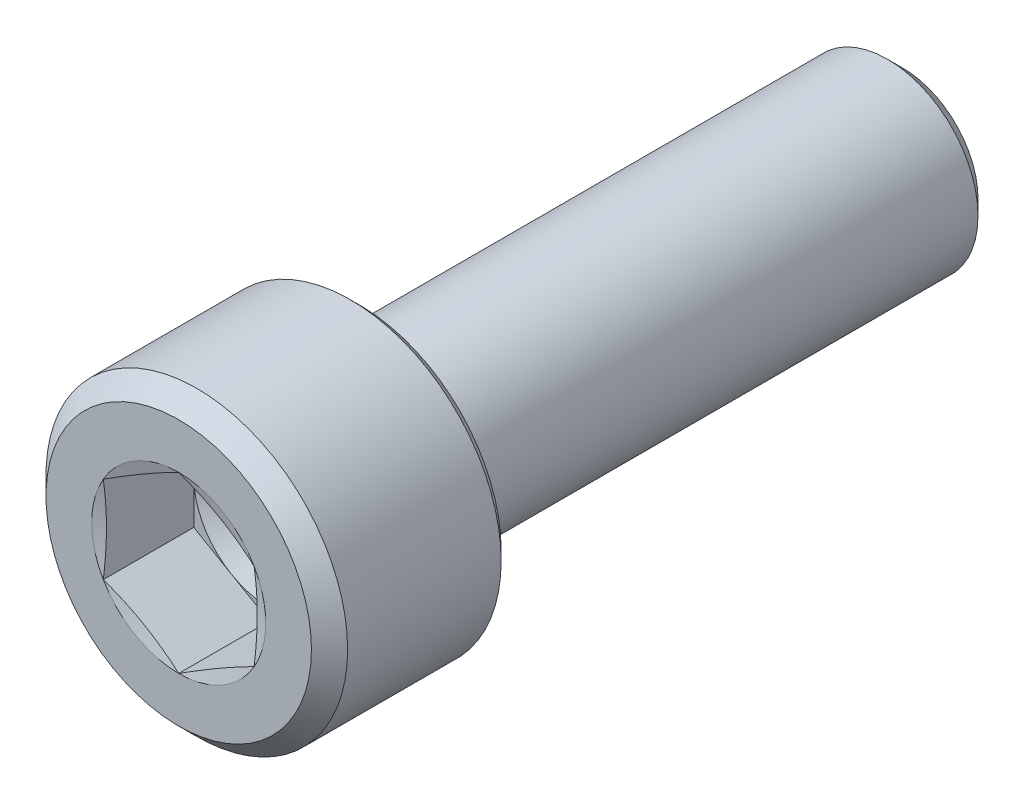
ISO-10303-21;
HEADER;
FILE_DESCRIPTION(('STEP AP214'),'2;1');
FILE_NAME('part.step','',(''),(''),'','','');
FILE_SCHEMA(('AUTOMOTIVE_DESIGN { 1 0 10303 214 1 1 1 1 }'));
ENDSEC;
DATA;
#1=APPLICATION_CONTEXT('core data for automotive mechanical design processes');
#2=APPLICATION_PROTOCOL_DEFINITION('international standard','automotive_design',2000,#1);
#3=PRODUCT_CONTEXT('',#1,'mechanical');
#4=PRODUCT('Part','Part','',(#3));
#5=PRODUCT_RELATED_PRODUCT_CATEGORY('part','',(#4));
#6=PRODUCT_DEFINITION_FORMATION('','',#4);
#7=PRODUCT_DEFINITION_CONTEXT('part definition',#1,'design');
#8=PRODUCT_DEFINITION('design','',#6,#7);
#9=PRODUCT_DEFINITION_SHAPE('','',#8);
#10=(LENGTH_UNIT() NAMED_UNIT(*) SI_UNIT(.MILLI.,.METRE.));
#11=(NAMED_UNIT(*) PLANE_ANGLE_UNIT() SI_UNIT($,.RADIAN.));
#12=(NAMED_UNIT(*) SI_UNIT($,.STERADIAN.) SOLID_ANGLE_UNIT());
#13=UNCERTAINTY_MEASURE_WITH_UNIT(LENGTH_MEASURE(1.E-05),#10,'distance_accuracy_value','');
#14=(GEOMETRIC_REPRESENTATION_CONTEXT(3) GLOBAL_UNCERTAINTY_ASSIGNED_CONTEXT((#13)) GLOBAL_UNIT_ASSIGNED_CONTEXT((#10,
#11,#12)) REPRESENTATION_CONTEXT('',''));
#15=CARTESIAN_POINT('',(0.,0.,0.));
#16=DIRECTION('',(0.,0.,1.));
#17=DIRECTION('',(1.,0.,0.));
#18=AXIS2_PLACEMENT_3D('',#15,#16,#17);
#19=CARTESIAN_POINT('',(0.,0.,0.));
#20=DIRECTION('',(0.,0.,-1.));
#21=DIRECTION('',(-1.,0.,0.));
#22=AXIS2_PLACEMENT_3D('',#19,#20,#21);
#23=PLANE('',#22);
#24=CARTESIAN_POINT('',(0.,0.,0.));
#25=DIRECTION('',(0.,0.,1.));
#26=DIRECTION('',(1.,0.,0.));
#27=AXIS2_PLACEMENT_3D('',#24,#25,#26);
#28=CIRCLE('',#27,4.4);
#29=CARTESIAN_POINT('',(4.4,0.,0.));
#30=VERTEX_POINT('',#29);
#31=EDGE_CURVE('E203',#30,#30,#28,.T.);
#32=ORIENTED_EDGE('',*,*,#31,.T.);
#33=EDGE_LOOP('',(#32));
#34=FACE_BOUND('',#33,.T.);
#35=CARTESIAN_POINT('',(0.,0.,0.));
#36=DIRECTION('',(0.,0.,1.));
#37=DIRECTION('',(1.,0.,0.));
#38=AXIS2_PLACEMENT_3D('',#35,#36,#37);
#39=CIRCLE('',#38,2.88675134594813);
#40=CARTESIAN_POINT('',(-2.5,-1.44337567297407,0.));
#41=VERTEX_POINT('',#40);
#42=CARTESIAN_POINT('',(0.,-2.88675134594813,0.));
#43=VERTEX_POINT('',#42);
#44=EDGE_CURVE('E131',#41,#43,#39,.T.);
#45=ORIENTED_EDGE('',*,*,#44,.F.);
#46=CARTESIAN_POINT('',(-2.5,1.44337567297407,0.));
#47=VERTEX_POINT('',#46);
#48=EDGE_CURVE('E130',#47,#41,#39,.T.);
#49=ORIENTED_EDGE('',*,*,#48,.F.);
#50=CARTESIAN_POINT('',(0.,2.88675134594813,0.));
#51=VERTEX_POINT('',#50);
#52=EDGE_CURVE('E97',#51,#47,#39,.T.);
#53=ORIENTED_EDGE('',*,*,#52,.F.);
#54=CARTESIAN_POINT('',(2.5,1.44337567297407,0.));
#55=VERTEX_POINT('',#54);
#56=EDGE_CURVE('E91',#55,#51,#39,.T.);
#57=ORIENTED_EDGE('',*,*,#56,.F.);
#58=CARTESIAN_POINT('',(2.5,-1.44337567297406,0.));
#59=VERTEX_POINT('',#58);
#60=EDGE_CURVE('E99',#59,#55,#39,.T.);
#61=ORIENTED_EDGE('',*,*,#60,.F.);
#62=EDGE_CURVE('E287',#43,#59,#39,.T.);
#63=ORIENTED_EDGE('',*,*,#62,.F.);
#64=EDGE_LOOP('',(#45,#49,#53,#57,#61,#63));
#65=FACE_BOUND('',#64,.T.);
#66=ADVANCED_FACE('F15',(#34,#65),#23,.F.);
#67=CARTESIAN_POINT('',(0.,0.,-0.599999999999999));
#68=DIRECTION('',(0.,0.,-1.));
#69=DIRECTION('',(-1.,0.,0.));
#70=AXIS2_PLACEMENT_3D('',#67,#68,#69);
#71=CONICAL_SURFACE('',#70,5.,0.78539816339745);
#72=ORIENTED_EDGE('',*,*,#31,.F.);
#73=EDGE_LOOP('',(#72));
#74=FACE_BOUND('',#73,.T.);
#75=CARTESIAN_POINT('',(0.,0.,-0.599999999999999));
#76=DIRECTION('',(0.,0.,1.));
#77=DIRECTION('',(1.,0.,0.));
#78=AXIS2_PLACEMENT_3D('',#75,#76,#77);
#79=CIRCLE('',#78,5.);
#80=CARTESIAN_POINT('',(5.,0.,-0.599999999999999));
#81=VERTEX_POINT('',#80);
#82=EDGE_CURVE('E205',#81,#81,#79,.T.);
#83=ORIENTED_EDGE('',*,*,#82,.T.);
#84=EDGE_LOOP('',(#83));
#85=FACE_BOUND('',#84,.T.);
#86=ADVANCED_FACE('F193',(#74,#85),#71,.T.);
#87=CARTESIAN_POINT('',(0.,0.,0.));
#88=DIRECTION('',(0.,0.,1.));
#89=DIRECTION('',(1.,0.,0.));
#90=AXIS2_PLACEMENT_3D('',#87,#88,#89);
#91=CYLINDRICAL_SURFACE('',#90,5.);
#92=ORIENTED_EDGE('',*,*,#82,.F.);
#93=EDGE_LOOP('',(#92));
#94=FACE_BOUND('',#93,.T.);
#95=CARTESIAN_POINT('',(0.,0.,-5.69));
#96=DIRECTION('',(0.,0.,1.));
#97=DIRECTION('',(1.,0.,0.));
#98=AXIS2_PLACEMENT_3D('',#95,#96,#97);
#99=CIRCLE('',#98,5.);
#100=CARTESIAN_POINT('',(5.,0.,-5.69));
#101=VERTEX_POINT('',#100);
#102=EDGE_CURVE('E208',#101,#101,#99,.T.);
#103=ORIENTED_EDGE('',*,*,#102,.T.);
#104=EDGE_LOOP('',(#103));
#105=FACE_BOUND('',#104,.T.);
#106=ADVANCED_FACE('F199',(#94,#105),#91,.T.);
#107=CARTESIAN_POINT('',(0.,0.,-6.));
#108=DIRECTION('',(0.,0.,1.));
#109=DIRECTION('',(1.,0.,0.));
#110=AXIS2_PLACEMENT_3D('',#107,#108,#109);
#111=CONICAL_SURFACE('',#110,4.69,0.785398163397452);
#112=ORIENTED_EDGE('',*,*,#102,.F.);
#113=EDGE_LOOP('',(#112));
#114=FACE_BOUND('',#113,.T.);
#115=CARTESIAN_POINT('',(0.,0.,-6.));
#116=DIRECTION('',(0.,0.,1.));
#117=DIRECTION('',(1.,0.,0.));
#118=AXIS2_PLACEMENT_3D('',#115,#116,#117);
#119=CIRCLE('',#118,4.69);
#120=CARTESIAN_POINT('',(4.69,0.,-6.));
#121=VERTEX_POINT('',#120);
#122=EDGE_CURVE('E213',#121,#121,#119,.T.);
#123=ORIENTED_EDGE('',*,*,#122,.T.);
#124=EDGE_LOOP('',(#123));
#125=FACE_BOUND('',#124,.T.);
#126=ADVANCED_FACE('F421',(#114,#125),#111,.T.);
#127=CARTESIAN_POINT('',(0.,4.69,-6.));
#128=DIRECTION('',(0.,0.,1.));
#129=DIRECTION('',(1.,0.,0.));
#130=AXIS2_PLACEMENT_3D('',#127,#128,#129);
#131=PLANE('',#130);
#132=ORIENTED_EDGE('',*,*,#122,.F.);
#133=EDGE_LOOP('',(#132));
#134=FACE_BOUND('',#133,.T.);
#135=CARTESIAN_POINT('',(0.,0.,-6.));
#136=DIRECTION('',(0.,0.,1.));
#137=DIRECTION('',(1.,0.,0.));
#138=AXIS2_PLACEMENT_3D('',#135,#136,#137);
#139=CIRCLE('',#138,3.4);
#140=CARTESIAN_POINT('',(3.4,0.,-6.));
#141=VERTEX_POINT('',#140);
#142=EDGE_CURVE('E216',#141,#141,#139,.T.);
#143=ORIENTED_EDGE('',*,*,#142,.T.);
#144=EDGE_LOOP('',(#143));
#145=FACE_BOUND('',#144,.T.);
#146=ADVANCED_FACE('F412',(#134,#145),#131,.F.);
#147=CARTESIAN_POINT('',(0.,0.,-6.25));
#148=DIRECTION('',(0.,0.,1.));
#149=DIRECTION('',(1.,0.,0.));
#150=AXIS2_PLACEMENT_3D('',#147,#148,#149);
#151=TOROIDAL_SURFACE('',#150,3.4,0.249999999999999);
#152=ORIENTED_EDGE('',*,*,#142,.F.);
#153=EDGE_LOOP('',(#152));
#154=FACE_BOUND('',#153,.T.);
#155=CARTESIAN_POINT('',(0.,0.,-6.16765696092043));
#156=DIRECTION('',(0.,0.,1.));
#157=DIRECTION('',(1.,0.,0.));
#158=AXIS2_PLACEMENT_3D('',#155,#156,#157);
#159=CIRCLE('',#158,3.16394995463856);
#160=CARTESIAN_POINT('',(3.16394995463856,0.,-6.16765696092043));
#161=VERTEX_POINT('',#160);
#162=EDGE_CURVE('E219',#161,#161,#159,.T.);
#163=ORIENTED_EDGE('',*,*,#162,.T.);
#164=EDGE_LOOP('',(#163));
#165=FACE_BOUND('',#164,.T.);
#166=ADVANCED_FACE('F403',(#154,#165),#151,.F.);
#167=CARTESIAN_POINT('',(0.,0.,-6.59765696092043));
#168=DIRECTION('',(0.,0.,1.));
#169=DIRECTION('',(1.,0.,0.));
#170=AXIS2_PLACEMENT_3D('',#167,#168,#169);
#171=CONICAL_SURFACE('',#170,3.01394995463856,0.335638550327612);
#172=ORIENTED_EDGE('',*,*,#162,.F.);
#173=EDGE_LOOP('',(#172));
#174=FACE_BOUND('',#173,.T.);
#175=CARTESIAN_POINT('',(0.,0.,-6.59765696092043));
#176=DIRECTION('',(0.,0.,1.));
#177=DIRECTION('',(1.,0.,0.));
#178=AXIS2_PLACEMENT_3D('',#175,#176,#177);
#179=CIRCLE('',#178,3.01394995463856);
#180=CARTESIAN_POINT('',(3.01394995463856,0.,-6.59765696092043));
#181=VERTEX_POINT('',#180);
#182=EDGE_CURVE('E222',#181,#181,#179,.T.);
#183=ORIENTED_EDGE('',*,*,#182,.T.);
#184=EDGE_LOOP('',(#183));
#185=FACE_BOUND('',#184,.T.);
#186=ADVANCED_FACE('F394',(#174,#185),#171,.T.);
#187=CARTESIAN_POINT('',(0.,0.,-6.68));
#188=DIRECTION('',(0.,0.,1.));
#189=DIRECTION('',(1.,0.,0.));
#190=AXIS2_PLACEMENT_3D('',#187,#188,#189);
#191=TOROIDAL_SURFACE('',#190,3.25,0.25);
#192=ORIENTED_EDGE('',*,*,#182,.F.);
#193=EDGE_LOOP('',(#192));
#194=FACE_BOUND('',#193,.T.);
#195=CARTESIAN_POINT('',(0.,0.,-6.68));
#196=DIRECTION('',(0.,0.,1.));
#197=DIRECTION('',(1.,0.,0.));
#198=AXIS2_PLACEMENT_3D('',#195,#196,#197);
#199=CIRCLE('',#198,3.);
#200=CARTESIAN_POINT('',(3.,0.,-6.68));
#201=VERTEX_POINT('',#200);
#202=EDGE_CURVE('E225',#201,#201,#199,.T.);
#203=ORIENTED_EDGE('',*,*,#202,.T.);
#204=EDGE_LOOP('',(#203));
#205=FACE_BOUND('',#204,.T.);
#206=ADVANCED_FACE('F385',(#194,#205),#191,.F.);
#207=CARTESIAN_POINT('',(0.,0.,0.));
#208=DIRECTION('',(0.,0.,1.));
#209=DIRECTION('',(1.,0.,0.));
#210=AXIS2_PLACEMENT_3D('',#207,#208,#209);
#211=CYLINDRICAL_SURFACE('',#210,3.);
#212=ORIENTED_EDGE('',*,*,#202,.F.);
#213=EDGE_LOOP('',(#212));
#214=FACE_BOUND('',#213,.T.);
#215=CARTESIAN_POINT('',(0.,0.,-23.5));
#216=DIRECTION('',(0.,0.,1.));
#217=DIRECTION('',(1.,0.,0.));
#218=AXIS2_PLACEMENT_3D('',#215,#216,#217);
#219=CIRCLE('',#218,3.);
#220=CARTESIAN_POINT('',(3.,0.,-23.5));
#221=VERTEX_POINT('',#220);
#222=EDGE_CURVE('E228',#221,#221,#219,.T.);
#223=ORIENTED_EDGE('',*,*,#222,.T.);
#224=EDGE_LOOP('',(#223));
#225=FACE_BOUND('',#224,.T.);
#226=ADVANCED_FACE('F376',(#214,#225),#211,.T.);
#227=CARTESIAN_POINT('',(0.,0.,-24.));
#228=DIRECTION('',(0.,0.,1.));
#229=DIRECTION('',(1.,0.,0.));
#230=AXIS2_PLACEMENT_3D('',#227,#228,#229);
#231=CONICAL_SURFACE('',#230,2.5,0.785398163397455);
#232=ORIENTED_EDGE('',*,*,#222,.F.);
#233=EDGE_LOOP('',(#232));
#234=FACE_BOUND('',#233,.T.);
#235=CARTESIAN_POINT('',(0.,0.,-24.));
#236=DIRECTION('',(0.,0.,1.));
#237=DIRECTION('',(1.,0.,0.));
#238=AXIS2_PLACEMENT_3D('',#235,#236,#237);
#239=CIRCLE('',#238,2.5);
#240=CARTESIAN_POINT('',(2.5,0.,-24.));
#241=VERTEX_POINT('',#240);
#242=EDGE_CURVE('E231',#241,#241,#239,.T.);
#243=ORIENTED_EDGE('',*,*,#242,.T.);
#244=EDGE_LOOP('',(#243));
#245=FACE_BOUND('',#244,.T.);
#246=ADVANCED_FACE('F367',(#234,#245),#231,.T.);
#247=CARTESIAN_POINT('',(0.,2.5,-24.));
#248=DIRECTION('',(0.,0.,1.));
#249=DIRECTION('',(1.,0.,0.));
#250=AXIS2_PLACEMENT_3D('',#247,#248,#249);
#251=PLANE('',#250);
#252=ORIENTED_EDGE('',*,*,#242,.F.);
#253=EDGE_LOOP('',(#252));
#254=FACE_BOUND('',#253,.T.);
#255=ADVANCED_FACE('F360',(#254),#251,.F.);
#256=CARTESIAN_POINT('',(0.,0.,-0.103629710818449));
#257=DIRECTION('',(0.,0.,1.));
#258=DIRECTION('',(1.,0.,0.));
#259=AXIS2_PLACEMENT_3D('',#256,#257,#258);
#260=CONICAL_SURFACE('',#259,2.5,1.30899693899575);
#261=ORIENTED_EDGE('',*,*,#52,.T.);
#262=CARTESIAN_POINT('',(-2.5002,1.44326020292023,3.09419640078327E-05));
#263=CARTESIAN_POINT('',(-2.3963647277611,1.50320952529874,-0.0160404315877912));
#264=CARTESIAN_POINT('',(-2.29234116960921,1.56326755459979,-0.0306306771178117));
#265=CARTESIAN_POINT('',(-2.08392662601295,1.68359574744812,-0.0562644794602667));
#266=CARTESIAN_POINT('',(-1.97953550863948,1.74386598716471,-0.0673065951638286));
#267=CARTESIAN_POINT('',(-1.77101887822002,1.8642531198679,-0.0851994090604318));
#268=CARTESIAN_POINT('',(-1.66689477566614,1.9243691985065,-0.0920714486702324));
#269=CARTESIAN_POINT('',(-1.45851376233156,2.04467803264923,-0.101286161227743));
#270=CARTESIAN_POINT('',(-1.35425688116578,2.10487077105516,-0.103629710818448));
#271=CARTESIAN_POINT('',(-1.14574311883422,2.22525624786703,-0.103629710818448));
#272=CARTESIAN_POINT('',(-1.04148623766843,2.28544898627297,-0.101286161227743));
#273=CARTESIAN_POINT('',(-0.833105224333855,2.4057578204157,-0.0920714486702323));
#274=CARTESIAN_POINT('',(-0.728981121779983,2.4658738990543,-0.0851994090604318));
#275=CARTESIAN_POINT('',(-0.520464491360523,2.58626103175749,-0.0673065951638284));
#276=CARTESIAN_POINT('',(-0.416073373987047,2.64653127147407,-0.0562644794602665));
#277=CARTESIAN_POINT('',(-0.207658830390791,2.7668594643224,-0.0306306771178115));
#278=CARTESIAN_POINT('',(-0.103635272238903,2.82691749362346,-0.016040431587791));
#279=CARTESIAN_POINT('',(0.000200000000000633,2.88686681600197,3.09419640079173E-05));
#280=B_SPLINE_CURVE_WITH_KNOTS('',3,(#262,#263,#264,#265,#266,#267,#268,#269,#270,#271,#272,
#273,#274,#275,#276,#277,#278,#279),.UNSPECIFIED.,.F.,.F.,(4,2,2,2,2,2,2,2,4),(0.,
0.362931913815158,0.726011050322838,1.08721601235603,1.44835104389736,1.80948607543869,
2.17069103747188,2.53377017397956,2.89670208779472),.UNSPECIFIED.);
#281=EDGE_CURVE('E9',#47,#51,#280,.T.);
#282=ORIENTED_EDGE('',*,*,#281,.T.);
#283=EDGE_LOOP('',(#261,#282));
#284=FACE_BOUND('',#283,.T.);
#285=ADVANCED_FACE('F103',(#284),#260,.F.);
#286=CARTESIAN_POINT('',(-2.5,-3.81607528745377,0.448898750822263));
#287=CARTESIAN_POINT('',(-2.5,-3.70268222589733,0.423490022888473));
#288=CARTESIAN_POINT('',(-2.5,-3.58921822823278,0.398392881364473));
#289=CARTESIAN_POINT('',(-2.5,-3.36211340745449,0.348988750788404));
#290=CARTESIAN_POINT('',(-2.5,-3.24847257691113,0.324681795929632));
#291=CARTESIAN_POINT('',(-2.5,-3.02087703769944,0.277003803109804));
#292=CARTESIAN_POINT('',(-2.5,-2.90692213022999,0.253633709391547));
#293=CARTESIAN_POINT('',(-2.5,-2.67877535679218,0.208086780880581));
#294=CARTESIAN_POINT('',(-2.5,-2.56458349283676,0.185909935993961));
#295=CARTESIAN_POINT('',(-2.5,-2.22341982425459,0.121910877106936));
#296=CARTESIAN_POINT('',(-2.5,-1.99603830218398,0.0822302229364124));
#297=CARTESIAN_POINT('',(-2.5,-1.53988771892966,0.0116720496175827));
#298=CARTESIAN_POINT('',(-2.5,-1.31111890637465,-0.0192070019485673));
#299=CARTESIAN_POINT('',(-2.5,-0.965612085480585,-0.0559642465078483));
#300=CARTESIAN_POINT('',(-2.5,-0.849388361737326,-0.0666558282512374));
#301=CARTESIAN_POINT('',(-2.5,-0.616655377132936,-0.0842009570846986));
#302=CARTESIAN_POINT('',(-2.5,-0.500146141574661,-0.0910548327485627));
#303=CARTESIAN_POINT('',(-2.5,-0.267001550599814,-0.100527089710495));
#304=CARTESIAN_POINT('',(-2.5,-0.150366269056388,-0.103147255321986));
#305=CARTESIAN_POINT('',(-2.5,0.0829204090002316,-0.10399028327093));
#306=CARTESIAN_POINT('',(-2.5,0.199571805500895,-0.102213149008376));
#307=CARTESIAN_POINT('',(-2.5,0.433147940164822,-0.09436195748554));
#308=CARTESIAN_POINT('',(-2.5,0.550072149359405,-0.0882724452898564));
#309=CARTESIAN_POINT('',(-2.5,0.783651629721234,-0.0721426206173039));
#310=CARTESIAN_POINT('',(-2.5,0.900306876564898,-0.0621019639074798));
#311=CARTESIAN_POINT('',(-2.5,1.24987827661572,-0.0268172856222201));
#312=CARTESIAN_POINT('',(-2.5,1.48227255568164,0.00358412310984416));
#313=CARTESIAN_POINT('',(-2.5,1.93002655518119,0.0714138007905057));
#314=CARTESIAN_POINT('',(-2.5,2.14548347256994,0.108234090127695));
#315=CARTESIAN_POINT('',(-2.5,2.57541124173799,0.187324733638172));
#316=CARTESIAN_POINT('',(-2.5,2.78988196550051,0.229595775775308));
#317=CARTESIAN_POINT('',(-2.5,3.2181052382832,0.317793502316737));
#318=CARTESIAN_POINT('',(-2.5,3.43185763378042,0.363720922081292));
#319=CARTESIAN_POINT('',(-2.5,3.85881275448637,0.458069959265328));
#320=CARTESIAN_POINT('',(-2.5,4.07201546822918,0.506491628277899));
#321=CARTESIAN_POINT('',(-2.5,4.49591231305092,0.604599288732733));
#322=CARTESIAN_POINT('',(-2.5,4.70661044026336,0.654268092023149));
#323=CARTESIAN_POINT('',(-2.5,5.12771281191888,0.754849972800793));
#324=CARTESIAN_POINT('',(-2.5,5.33811705095724,0.80576307286073));
#325=CARTESIAN_POINT('',(-2.5,5.75844185155037,0.908445331221202));
#326=CARTESIAN_POINT('',(-2.5,5.96836268971444,0.960213359733673));
#327=CARTESIAN_POINT('',(-2.5,6.38802143165175,1.06445683710807));
#328=CARTESIAN_POINT('',(-2.5,6.59775934122022,1.11693226262348));
#329=CARTESIAN_POINT('',(-2.5,6.80743348121522,1.16965832285731));
#330=B_SPLINE_CURVE_WITH_KNOTS('',3,(#286,#287,#288,#289,#290,#291,#292,#293,#294,#295,#296,
#297,#298,#299,#300,#301,#302,#303,#304,#305,#306,#307,#308,#309,#310,#311,#312,#313,#314,#315,
#316,#317,#318,#319,#320,#321,#322,#323,#324,#325,#326,#327,#328,#329),.UNSPECIFIED.,.F.,.F.,(4,
2,2,2,2,2,2,2,2,2,2,2,2,2,2,2,2,2,2,2,2,4),(0.,0.348615963150093,0.697246991733421,
1.04622099004378,1.39519203585453,2.08754680874317,2.77978096430401,3.12987133055866,
3.47993171845836,3.82984453354037,4.17975707806977,4.53093004646434,4.88213361664562,
5.58492300307792,6.24058068113987,6.89632119383297,7.55219392197656,8.20808022217989,
8.85749522889879,9.50692202537157,10.155550152628,10.8041569250998),.UNSPECIFIED.);
#331=EDGE_CURVE('E96',#41,#47,#330,.T.);
#332=ORIENTED_EDGE('',*,*,#331,.T.);
#333=ORIENTED_EDGE('',*,*,#48,.T.);
#334=EDGE_LOOP('',(#332,#333));
#335=FACE_BOUND('',#334,.T.);
#336=ADVANCED_FACE('F345',(#335),#260,.F.);
#337=CARTESIAN_POINT('',(0.000199999999999656,-2.88686681600197,3.09419640072472E-05));
#338=CARTESIAN_POINT('',(-0.103635272238904,-2.82691749362346,-0.0160404315877918));
#339=CARTESIAN_POINT('',(-0.207658830390792,-2.7668594643224,-0.0306306771178123));
#340=CARTESIAN_POINT('',(-0.416073373987048,-2.64653127147407,-0.0562644794602673));
#341=CARTESIAN_POINT('',(-0.520464491360523,-2.58626103175749,-0.0673065951638292));
#342=CARTESIAN_POINT('',(-0.728981121779984,-2.4658738990543,-0.0851994090604324));
#343=CARTESIAN_POINT('',(-0.833105224333855,-2.40575782041569,-0.0920714486702329));
#344=CARTESIAN_POINT('',(-1.04148623766843,-2.28544898627297,-0.101286161227744));
#345=CARTESIAN_POINT('',(-1.14574311883422,-2.22525624786703,-0.103629710818449));
#346=CARTESIAN_POINT('',(-1.35425688116578,-2.10487077105516,-0.103629710818449));
#347=CARTESIAN_POINT('',(-1.45851376233157,-2.04467803264922,-0.101286161227744));
#348=CARTESIAN_POINT('',(-1.66689477566614,-1.9243691985065,-0.092071448670233));
#349=CARTESIAN_POINT('',(-1.77101887822002,-1.86425311986789,-0.0851994090604324));
#350=CARTESIAN_POINT('',(-1.97953550863948,-1.7438659871647,-0.0673065951638292));
#351=CARTESIAN_POINT('',(-2.08392662601295,-1.68359574744812,-0.0562644794602673));
#352=CARTESIAN_POINT('',(-2.29234116960921,-1.56326755459979,-0.0306306771178123));
#353=CARTESIAN_POINT('',(-2.3963647277611,-1.50320952529873,-0.0160404315877917));
#354=CARTESIAN_POINT('',(-2.5002,-1.44326020292023,3.0941964007367E-05));
#355=B_SPLINE_CURVE_WITH_KNOTS('',3,(#337,#338,#339,#340,#341,#342,#343,#344,#345,#346,#347,
#348,#349,#350,#351,#352,#353,#354),.UNSPECIFIED.,.F.,.F.,(4,2,2,2,2,2,2,2,4),(0.,
0.362931913815158,0.726011050322838,1.08721601235603,1.44835104389736,1.80948607543869,
2.17069103747188,2.53377017397956,2.89670208779472),.UNSPECIFIED.);
#356=EDGE_CURVE('E138',#43,#41,#355,.T.);
#357=ORIENTED_EDGE('',*,*,#356,.T.);
#358=ORIENTED_EDGE('',*,*,#44,.T.);
#359=EDGE_LOOP('',(#357,#358));
#360=FACE_BOUND('',#359,.T.);
#361=ADVANCED_FACE('F338',(#360),#260,.F.);
#362=CARTESIAN_POINT('',(2.5002,-1.44326020292023,3.09419640074895E-05));
#363=CARTESIAN_POINT('',(2.3963647277611,-1.50320952529874,-0.0160404315877914));
#364=CARTESIAN_POINT('',(2.29234116960921,-1.56326755459979,-0.030630677117812));
#365=CARTESIAN_POINT('',(2.08392662601295,-1.68359574744812,-0.0562644794602671));
#366=CARTESIAN_POINT('',(1.97953550863948,-1.7438659871647,-0.067306595163829));
#367=CARTESIAN_POINT('',(1.77101887822002,-1.86425311986789,-0.0851994090604323));
#368=CARTESIAN_POINT('',(1.66689477566614,-1.9243691985065,-0.0920714486702328));
#369=CARTESIAN_POINT('',(1.45851376233157,-2.04467803264922,-0.101286161227744));
#370=CARTESIAN_POINT('',(1.35425688116578,-2.10487077105516,-0.103629710818449));
#371=CARTESIAN_POINT('',(1.14574311883422,-2.22525624786703,-0.103629710818449));
#372=CARTESIAN_POINT('',(1.04148623766843,-2.28544898627297,-0.101286161227744));
#373=CARTESIAN_POINT('',(0.833105224333855,-2.40575782041569,-0.0920714486702329));
#374=CARTESIAN_POINT('',(0.728981121779984,-2.4658738990543,-0.0851994090604324));
#375=CARTESIAN_POINT('',(0.520464491360523,-2.58626103175749,-0.0673065951638292));
#376=CARTESIAN_POINT('',(0.416073373987048,-2.64653127147407,-0.0562644794602673));
#377=CARTESIAN_POINT('',(0.207658830390792,-2.7668594643224,-0.0306306771178124));
#378=CARTESIAN_POINT('',(0.103635272238904,-2.82691749362346,-0.0160404315877919));
#379=CARTESIAN_POINT('',(-0.000199999999999934,-2.88686681600197,3.09419640071601E-05));
#380=B_SPLINE_CURVE_WITH_KNOTS('',3,(#362,#363,#364,#365,#366,#367,#368,#369,#370,#371,#372,
#373,#374,#375,#376,#377,#378,#379),.UNSPECIFIED.,.F.,.F.,(4,2,2,2,2,2,2,2,4),(0.,
0.362931913815159,0.726011050322838,1.08721601235603,1.44835104389736,1.80948607543869,
2.17069103747188,2.53377017397956,2.89670208779472),.UNSPECIFIED.);
#381=EDGE_CURVE('E157',#59,#43,#380,.T.);
#382=ORIENTED_EDGE('',*,*,#381,.T.);
#383=ORIENTED_EDGE('',*,*,#62,.T.);
#384=EDGE_LOOP('',(#382,#383));
#385=FACE_BOUND('',#384,.T.);
#386=ADVANCED_FACE('F331',(#385),#260,.F.);
#387=CARTESIAN_POINT('',(2.5,-3.81607528745378,0.448898750822263));
#388=CARTESIAN_POINT('',(2.5,-3.70268222589733,0.423490022888473));
#389=CARTESIAN_POINT('',(2.5,-3.58921822823278,0.398392881364473));
#390=CARTESIAN_POINT('',(2.5,-3.36211340745449,0.348988750788405));
#391=CARTESIAN_POINT('',(2.5,-3.24847257691113,0.324681795929633));
#392=CARTESIAN_POINT('',(2.5,-3.02087703769944,0.277003803109804));
#393=CARTESIAN_POINT('',(2.5,-2.90692213023,0.253633709391547));
#394=CARTESIAN_POINT('',(2.5,-2.67877535679218,0.208086780880582));
#395=CARTESIAN_POINT('',(2.5,-2.56458349283676,0.185909935993962));
#396=CARTESIAN_POINT('',(2.5,-2.22341982425459,0.121910877106936));
#397=CARTESIAN_POINT('',(2.5,-1.99603830218398,0.0822302229364126));
#398=CARTESIAN_POINT('',(2.5,-1.53988771892967,0.0116720496175827));
#399=CARTESIAN_POINT('',(2.5,-1.31111890637465,-0.0192070019485672));
#400=CARTESIAN_POINT('',(2.5,-0.965612085480586,-0.0559642465078481));
#401=CARTESIAN_POINT('',(2.5,-0.849388361737327,-0.0666558282512373));
#402=CARTESIAN_POINT('',(2.5,-0.616655377132937,-0.0842009570846985));
#403=CARTESIAN_POINT('',(2.5,-0.500146141574662,-0.0910548327485627));
#404=CARTESIAN_POINT('',(2.5,-0.267001550599815,-0.100527089710495));
#405=CARTESIAN_POINT('',(2.5,-0.150366269056389,-0.103147255321986));
#406=CARTESIAN_POINT('',(2.5,0.0829204090002306,-0.10399028327093));
#407=CARTESIAN_POINT('',(2.5,0.199571805500894,-0.102213149008376));
#408=CARTESIAN_POINT('',(2.5,0.433147940164821,-0.09436195748554));
#409=CARTESIAN_POINT('',(2.5,0.550072149359404,-0.0882724452898564));
#410=CARTESIAN_POINT('',(2.5,0.783651629721233,-0.0721426206173039));
#411=CARTESIAN_POINT('',(2.5,0.900306876564897,-0.0621019639074799));
#412=CARTESIAN_POINT('',(2.5,1.24987827661571,-0.0268172856222202));
#413=CARTESIAN_POINT('',(2.5,1.48227255568164,0.00358412310984413));
#414=CARTESIAN_POINT('',(2.5,1.93002655518119,0.0714138007905059));
#415=CARTESIAN_POINT('',(2.5,2.14548347256994,0.108234090127695));
#416=CARTESIAN_POINT('',(2.5,2.57541124173799,0.187324733638172));
#417=CARTESIAN_POINT('',(2.5,2.78988196550051,0.229595775775308));
#418=CARTESIAN_POINT('',(2.5,3.21810523828321,0.317793502316737));
#419=CARTESIAN_POINT('',(2.5,3.43185763378042,0.363720922081293));
#420=CARTESIAN_POINT('',(2.5,3.85881275448638,0.458069959265329));
#421=CARTESIAN_POINT('',(2.5,4.07201546822918,0.5064916282779));
#422=CARTESIAN_POINT('',(2.5,4.49591231305093,0.604599288732734));
#423=CARTESIAN_POINT('',(2.5,4.70661044026336,0.65426809202315));
#424=CARTESIAN_POINT('',(2.5,5.12771281191888,0.754849972800793));
#425=CARTESIAN_POINT('',(2.5,5.33811705095724,0.80576307286073));
#426=CARTESIAN_POINT('',(2.5,5.75844185155038,0.908445331221202));
#427=CARTESIAN_POINT('',(2.5,5.96836268971444,0.960213359733673));
#428=CARTESIAN_POINT('',(2.5,6.38802143165175,1.06445683710807));
#429=CARTESIAN_POINT('',(2.5,6.59775934122022,1.11693226262348));
#430=CARTESIAN_POINT('',(2.5,6.80743348121522,1.16965832285731));
#431=B_SPLINE_CURVE_WITH_KNOTS('',3,(#387,#388,#389,#390,#391,#392,#393,#394,#395,#396,#397,
#398,#399,#400,#401,#402,#403,#404,#405,#406,#407,#408,#409,#410,#411,#412,#413,#414,#415,#416,
#417,#418,#419,#420,#421,#422,#423,#424,#425,#426,#427,#428,#429,#430),.UNSPECIFIED.,.F.,.F.,(4,
2,2,2,2,2,2,2,2,2,2,2,2,2,2,2,2,2,2,2,2,4),(0.,0.348615963150093,0.697246991733421,
1.04622099004378,1.39519203585453,2.08754680874317,2.77978096430401,3.12987133055866,
3.47993171845836,3.82984453354037,4.17975707806977,4.53093004646434,4.88213361664562,
5.58492300307792,6.24058068113987,6.89632119383297,7.55219392197657,8.20808022217989,
8.85749522889879,9.50692202537157,10.155550152628,10.8041569250998),.UNSPECIFIED.);
#432=EDGE_CURVE('E39',#55,#59,#431,.F.);
#433=ORIENTED_EDGE('',*,*,#432,.T.);
#434=ORIENTED_EDGE('',*,*,#60,.T.);
#435=EDGE_LOOP('',(#433,#434));
#436=FACE_BOUND('',#435,.T.);
#437=ADVANCED_FACE('F150',(#436),#260,.F.);
#438=CARTESIAN_POINT('',(-0.000199999999999234,2.88686681600197,3.09419640079894E-05));
#439=CARTESIAN_POINT('',(0.103635272238905,2.82691749362346,-0.0160404315877909));
#440=CARTESIAN_POINT('',(0.207658830390793,2.7668594643224,-0.0306306771178115));
#441=CARTESIAN_POINT('',(0.416073373987049,2.64653127147407,-0.0562644794602665));
#442=CARTESIAN_POINT('',(0.520464491360524,2.58626103175749,-0.0673065951638284));
#443=CARTESIAN_POINT('',(0.728981121779984,2.4658738990543,-0.0851994090604317));
#444=CARTESIAN_POINT('',(0.833105224333856,2.4057578204157,-0.0920714486702322));
#445=CARTESIAN_POINT('',(1.04148623766844,2.28544898627297,-0.101286161227743));
#446=CARTESIAN_POINT('',(1.14574311883422,2.22525624786703,-0.103629710818448));
#447=CARTESIAN_POINT('',(1.35425688116578,2.10487077105516,-0.103629710818448));
#448=CARTESIAN_POINT('',(1.45851376233157,2.04467803264923,-0.101286161227743));
#449=CARTESIAN_POINT('',(1.66689477566614,1.9243691985065,-0.0920714486702323));
#450=CARTESIAN_POINT('',(1.77101887822002,1.8642531198679,-0.0851994090604318));
#451=CARTESIAN_POINT('',(1.97953550863948,1.74386598716471,-0.0673065951638286));
#452=CARTESIAN_POINT('',(2.08392662601295,1.68359574744812,-0.0562644794602666));
#453=CARTESIAN_POINT('',(2.29234116960921,1.56326755459979,-0.0306306771178116));
#454=CARTESIAN_POINT('',(2.3963647277611,1.50320952529874,-0.016040431587791));
#455=CARTESIAN_POINT('',(2.5002,1.44326020292023,3.09419640078353E-05));
#456=B_SPLINE_CURVE_WITH_KNOTS('',3,(#438,#439,#440,#441,#442,#443,#444,#445,#446,#447,#448,
#449,#450,#451,#452,#453,#454,#455),.UNSPECIFIED.,.F.,.F.,(4,2,2,2,2,2,2,2,4),(0.,
0.362931913815158,0.726011050322838,1.08721601235603,1.44835104389736,1.80948607543869,
2.17069103747188,2.53377017397956,2.89670208779472),.UNSPECIFIED.);
#457=EDGE_CURVE('E33',#51,#55,#456,.T.);
#458=ORIENTED_EDGE('',*,*,#457,.T.);
#459=ORIENTED_EDGE('',*,*,#56,.T.);
#460=EDGE_LOOP('',(#458,#459));
#461=FACE_BOUND('',#460,.T.);
#462=ADVANCED_FACE('F92',(#461),#260,.F.);
#463=CARTESIAN_POINT('',(0.,0.,-4.44337567297406));
#464=DIRECTION('',(0.,0.,1.));
#465=DIRECTION('',(1.,0.,0.));
#466=AXIS2_PLACEMENT_3D('',#463,#464,#465);
#467=CONICAL_SURFACE('',#466,0.,1.0471975511966);
#468=CARTESIAN_POINT('',(0.,0.,-3.));
#469=DIRECTION('',(0.,0.,1.));
#470=DIRECTION('',(1.,0.,0.));
#471=AXIS2_PLACEMENT_3D('',#468,#469,#470);
#472=CIRCLE('',#471,2.5);
#473=CARTESIAN_POINT('',(2.5,0.,-3.));
#474=VERTEX_POINT('',#473);
#475=CARTESIAN_POINT('',(1.25,2.1650635094611,-3.));
#476=VERTEX_POINT('',#475);
#477=EDGE_CURVE('E119',#474,#476,#472,.T.);
#478=ORIENTED_EDGE('',*,*,#477,.T.);
#479=CARTESIAN_POINT('',(-1.25,2.1650635094611,-3.));
#480=VERTEX_POINT('',#479);
#481=EDGE_CURVE('E27',#476,#480,#472,.T.);
#482=ORIENTED_EDGE('',*,*,#481,.T.);
#483=CARTESIAN_POINT('',(-2.5,0.,-3.));
#484=VERTEX_POINT('',#483);
#485=EDGE_CURVE('E268',#480,#484,#472,.T.);
#486=ORIENTED_EDGE('',*,*,#485,.T.);
#487=CARTESIAN_POINT('',(-1.25,-2.1650635094611,-3.));
#488=VERTEX_POINT('',#487);
#489=EDGE_CURVE('E270',#484,#488,#472,.T.);
#490=ORIENTED_EDGE('',*,*,#489,.T.);
#491=CARTESIAN_POINT('',(1.25,-2.1650635094611,-3.));
#492=VERTEX_POINT('',#491);
#493=EDGE_CURVE('E206',#488,#492,#472,.T.);
#494=ORIENTED_EDGE('',*,*,#493,.T.);
#495=EDGE_CURVE('E204',#492,#474,#472,.T.);
#496=ORIENTED_EDGE('',*,*,#495,.T.);
#497=EDGE_LOOP('',(#478,#482,#486,#490,#494,#496));
#498=FACE_BOUND('',#497,.T.);
#499=CARTESIAN_POINT('',(0.,0.,-4.44337567297406));
#500=VERTEX_POINT('',#499);
#501=VERTEX_LOOP('',#500);
#502=FACE_BOUND('',#501,.T.);
#503=ADVANCED_FACE('F149',(#498,#502),#467,.F.);
#504=CARTESIAN_POINT('',(0.,0.,-3.));
#505=DIRECTION('',(0.,0.,1.));
#506=DIRECTION('',(1.,0.,0.));
#507=AXIS2_PLACEMENT_3D('',#504,#505,#506);
#508=PLANE('',#507);
#509=ORIENTED_EDGE('',*,*,#477,.F.);
#510=DIRECTION('',(0.,1.,0.));
#511=VECTOR('',#510,1.);
#512=CARTESIAN_POINT('',(2.5,-1.44337567297406,-3.));
#513=LINE('',#512,#511);
#514=CARTESIAN_POINT('',(2.5,1.44337567297407,-3.));
#515=VERTEX_POINT('',#514);
#516=EDGE_CURVE('E247',#474,#515,#513,.T.);
#517=ORIENTED_EDGE('',*,*,#516,.T.);
#518=DIRECTION('',(-0.866025403784439,0.5,0.));
#519=VECTOR('',#518,1.);
#520=CARTESIAN_POINT('',(2.5,1.44337567297407,-3.));
#521=LINE('',#520,#519);
#522=EDGE_CURVE('E262',#515,#476,#521,.T.);
#523=ORIENTED_EDGE('',*,*,#522,.T.);
#524=EDGE_LOOP('',(#509,#517,#523));
#525=FACE_BOUND('',#524,.T.);
#526=ADVANCED_FACE('F292',(#525),#508,.T.);
#527=ORIENTED_EDGE('',*,*,#495,.F.);
#528=DIRECTION('',(0.866025403784439,0.5,0.));
#529=VECTOR('',#528,1.);
#530=CARTESIAN_POINT('',(0.,-2.88675134594813,-3.));
#531=LINE('',#530,#529);
#532=CARTESIAN_POINT('',(2.5,-1.44337567297406,-3.));
#533=VERTEX_POINT('',#532);
#534=EDGE_CURVE('E251',#492,#533,#531,.T.);
#535=ORIENTED_EDGE('',*,*,#534,.T.);
#536=EDGE_CURVE('E126',#533,#474,#513,.T.);
#537=ORIENTED_EDGE('',*,*,#536,.T.);
#538=EDGE_LOOP('',(#527,#535,#537));
#539=FACE_BOUND('',#538,.T.);
#540=ADVANCED_FACE('F177',(#539),#508,.T.);
#541=ORIENTED_EDGE('',*,*,#493,.F.);
#542=DIRECTION('',(0.866025403784439,-0.5,0.));
#543=VECTOR('',#542,1.);
#544=CARTESIAN_POINT('',(-2.5,-1.44337567297406,-3.));
#545=LINE('',#544,#543);
#546=CARTESIAN_POINT('',(0.,-2.88675134594813,-3.));
#547=VERTEX_POINT('',#546);
#548=EDGE_CURVE('E255',#488,#547,#545,.T.);
#549=ORIENTED_EDGE('',*,*,#548,.T.);
#550=EDGE_CURVE('E248',#547,#492,#531,.T.);
#551=ORIENTED_EDGE('',*,*,#550,.T.);
#552=EDGE_LOOP('',(#541,#549,#551));
#553=FACE_BOUND('',#552,.T.);
#554=ADVANCED_FACE('F283',(#553),#508,.T.);
#555=ORIENTED_EDGE('',*,*,#489,.F.);
#556=DIRECTION('',(0.,-1.,0.));
#557=VECTOR('',#556,1.);
#558=CARTESIAN_POINT('',(-2.5,1.44337567297407,-3.));
#559=LINE('',#558,#557);
#560=CARTESIAN_POINT('',(-2.5,-1.44337567297406,-3.));
#561=VERTEX_POINT('',#560);
#562=EDGE_CURVE('E259',#484,#561,#559,.T.);
#563=ORIENTED_EDGE('',*,*,#562,.T.);
#564=EDGE_CURVE('E252',#561,#488,#545,.T.);
#565=ORIENTED_EDGE('',*,*,#564,.T.);
#566=EDGE_LOOP('',(#555,#563,#565));
#567=FACE_BOUND('',#566,.T.);
#568=ADVANCED_FACE('F297',(#567),#508,.T.);
#569=ORIENTED_EDGE('',*,*,#481,.F.);
#570=CARTESIAN_POINT('',(0.,2.88675134594813,-3.));
#571=VERTEX_POINT('',#570);
#572=EDGE_CURVE('E264',#476,#571,#521,.T.);
#573=ORIENTED_EDGE('',*,*,#572,.T.);
#574=DIRECTION('',(-0.866025403784439,-0.5,0.));
#575=VECTOR('',#574,1.);
#576=CARTESIAN_POINT('',(0.,2.88675134594813,-3.));
#577=LINE('',#576,#575);
#578=EDGE_CURVE('E124',#571,#480,#577,.T.);
#579=ORIENTED_EDGE('',*,*,#578,.T.);
#580=EDGE_LOOP('',(#569,#573,#579));
#581=FACE_BOUND('',#580,.T.);
#582=ADVANCED_FACE('F294',(#581),#508,.T.);
#583=ORIENTED_EDGE('',*,*,#485,.F.);
#584=CARTESIAN_POINT('',(-2.5,1.44337567297407,-3.));
#585=VERTEX_POINT('',#584);
#586=EDGE_CURVE('E261',#480,#585,#577,.T.);
#587=ORIENTED_EDGE('',*,*,#586,.T.);
#588=EDGE_CURVE('E256',#585,#484,#559,.T.);
#589=ORIENTED_EDGE('',*,*,#588,.T.);
#590=EDGE_LOOP('',(#583,#587,#589));
#591=FACE_BOUND('',#590,.T.);
#592=ADVANCED_FACE('F296',(#591),#508,.T.);
#593=CARTESIAN_POINT('',(0.,2.88675134594813,-3.));
#594=DIRECTION('',(-0.5,0.866025403784439,0.));
#595=DIRECTION('',(-0.866025403784439,-0.5,0.));
#596=AXIS2_PLACEMENT_3D('',#593,#594,#595);
#597=PLANE('',#596);
#598=ORIENTED_EDGE('',*,*,#281,.F.);
#599=DIRECTION('',(0.,0.,1.));
#600=VECTOR('',#599,1.);
#601=CARTESIAN_POINT('',(-2.5,1.44337567297407,-3.));
#602=LINE('',#601,#600);
#603=EDGE_CURVE('E125',#585,#47,#602,.T.);
#604=ORIENTED_EDGE('',*,*,#603,.F.);
#605=ORIENTED_EDGE('',*,*,#586,.F.);
#606=ORIENTED_EDGE('',*,*,#578,.F.);
#607=DIRECTION('',(0.,0.,1.));
#608=VECTOR('',#607,1.);
#609=CARTESIAN_POINT('',(0.,2.88675134594813,-3.));
#610=LINE('',#609,#608);
#611=EDGE_CURVE('E114',#571,#51,#610,.T.);
#612=ORIENTED_EDGE('',*,*,#611,.T.);
#613=EDGE_LOOP('',(#598,#604,#605,#606,#612));
#614=FACE_BOUND('',#613,.T.);
#615=ADVANCED_FACE('F121',(#614),#597,.F.);
#616=CARTESIAN_POINT('',(-2.5,1.44337567297407,-3.));
#617=DIRECTION('',(-1.,0.,0.));
#618=DIRECTION('',(0.,0.,1.));
#619=AXIS2_PLACEMENT_3D('',#616,#617,#618);
#620=PLANE('',#619);
#621=ORIENTED_EDGE('',*,*,#331,.F.);
#622=DIRECTION('',(0.,0.,1.));
#623=VECTOR('',#622,1.);
#624=CARTESIAN_POINT('',(-2.5,-1.44337567297406,-3.));
#625=LINE('',#624,#623);
#626=EDGE_CURVE('E235',#561,#41,#625,.T.);
#627=ORIENTED_EDGE('',*,*,#626,.F.);
#628=ORIENTED_EDGE('',*,*,#562,.F.);
#629=ORIENTED_EDGE('',*,*,#588,.F.);
#630=ORIENTED_EDGE('',*,*,#603,.T.);
#631=EDGE_LOOP('',(#621,#627,#628,#629,#630));
#632=FACE_BOUND('',#631,.T.);
#633=ADVANCED_FACE('F144',(#632),#620,.F.);
#634=CARTESIAN_POINT('',(-2.5,-1.44337567297406,-3.));
#635=DIRECTION('',(-0.5,-0.866025403784438,0.));
#636=DIRECTION('',(0.866025403784439,-0.5,0.));
#637=AXIS2_PLACEMENT_3D('',#634,#635,#636);
#638=PLANE('',#637);
#639=ORIENTED_EDGE('',*,*,#356,.F.);
#640=DIRECTION('',(0.,0.,1.));
#641=VECTOR('',#640,1.);
#642=CARTESIAN_POINT('',(0.,-2.88675134594813,-3.));
#643=LINE('',#642,#641);
#644=EDGE_CURVE('E238',#547,#43,#643,.T.);
#645=ORIENTED_EDGE('',*,*,#644,.F.);
#646=ORIENTED_EDGE('',*,*,#548,.F.);
#647=ORIENTED_EDGE('',*,*,#564,.F.);
#648=ORIENTED_EDGE('',*,*,#626,.T.);
#649=EDGE_LOOP('',(#639,#645,#646,#647,#648));
#650=FACE_BOUND('',#649,.T.);
#651=ADVANCED_FACE('F180',(#650),#638,.F.);
#652=CARTESIAN_POINT('',(0.,-2.88675134594813,-3.));
#653=DIRECTION('',(0.5,-0.866025403784439,0.));
#654=DIRECTION('',(0.866025403784439,0.5,0.));
#655=AXIS2_PLACEMENT_3D('',#652,#653,#654);
#656=PLANE('',#655);
#657=ORIENTED_EDGE('',*,*,#381,.F.);
#658=DIRECTION('',(0.,0.,1.));
#659=VECTOR('',#658,1.);
#660=CARTESIAN_POINT('',(2.5,-1.44337567297406,-3.));
#661=LINE('',#660,#659);
#662=EDGE_CURVE('E241',#533,#59,#661,.T.);
#663=ORIENTED_EDGE('',*,*,#662,.F.);
#664=ORIENTED_EDGE('',*,*,#534,.F.);
#665=ORIENTED_EDGE('',*,*,#550,.F.);
#666=ORIENTED_EDGE('',*,*,#644,.T.);
#667=EDGE_LOOP('',(#657,#663,#664,#665,#666));
#668=FACE_BOUND('',#667,.T.);
#669=ADVANCED_FACE('F175',(#668),#656,.F.);
#670=CARTESIAN_POINT('',(2.5,-1.44337567297406,-3.));
#671=DIRECTION('',(1.,0.,0.));
#672=DIRECTION('',(0.,0.,-1.));
#673=AXIS2_PLACEMENT_3D('',#670,#671,#672);
#674=PLANE('',#673);
#675=ORIENTED_EDGE('',*,*,#432,.F.);
#676=DIRECTION('',(0.,0.,1.));
#677=VECTOR('',#676,1.);
#678=CARTESIAN_POINT('',(2.5,1.44337567297407,-3.));
#679=LINE('',#678,#677);
#680=EDGE_CURVE('E118',#515,#55,#679,.T.);
#681=ORIENTED_EDGE('',*,*,#680,.F.);
#682=ORIENTED_EDGE('',*,*,#516,.F.);
#683=ORIENTED_EDGE('',*,*,#536,.F.);
#684=ORIENTED_EDGE('',*,*,#662,.T.);
#685=EDGE_LOOP('',(#675,#681,#682,#683,#684));
#686=FACE_BOUND('',#685,.T.);
#687=ADVANCED_FACE('F172',(#686),#674,.F.);
#688=CARTESIAN_POINT('',(2.5,1.44337567297407,-3.));
#689=DIRECTION('',(0.5,0.866025403784439,0.));
#690=DIRECTION('',(-0.866025403784439,0.5,0.));
#691=AXIS2_PLACEMENT_3D('',#688,#689,#690);
#692=PLANE('',#691);
#693=ORIENTED_EDGE('',*,*,#457,.F.);
#694=ORIENTED_EDGE('',*,*,#611,.F.);
#695=ORIENTED_EDGE('',*,*,#572,.F.);
#696=ORIENTED_EDGE('',*,*,#522,.F.);
#697=ORIENTED_EDGE('',*,*,#680,.T.);
#698=EDGE_LOOP('',(#693,#694,#695,#696,#697));
#699=FACE_BOUND('',#698,.T.);
#700=ADVANCED_FACE('F112',(#699),#692,.F.);
#701=CLOSED_SHELL('',(#66,#86,#106,#126,#146,#166,#186,#206,#226,#246,#255,#285,#336,#361,#386,
#437,#462,#503,#526,#540,#554,#568,#582,#592,#615,#633,#651,#669,#687,#700));
#702=MANIFOLD_SOLID_BREP('B1',#701);
#703=ADVANCED_BREP_SHAPE_REPRESENTATION('',(#18,#702),#14);
#704=SHAPE_DEFINITION_REPRESENTATION(#9,#703);
ENDSEC;
END-ISO-10303-21;
